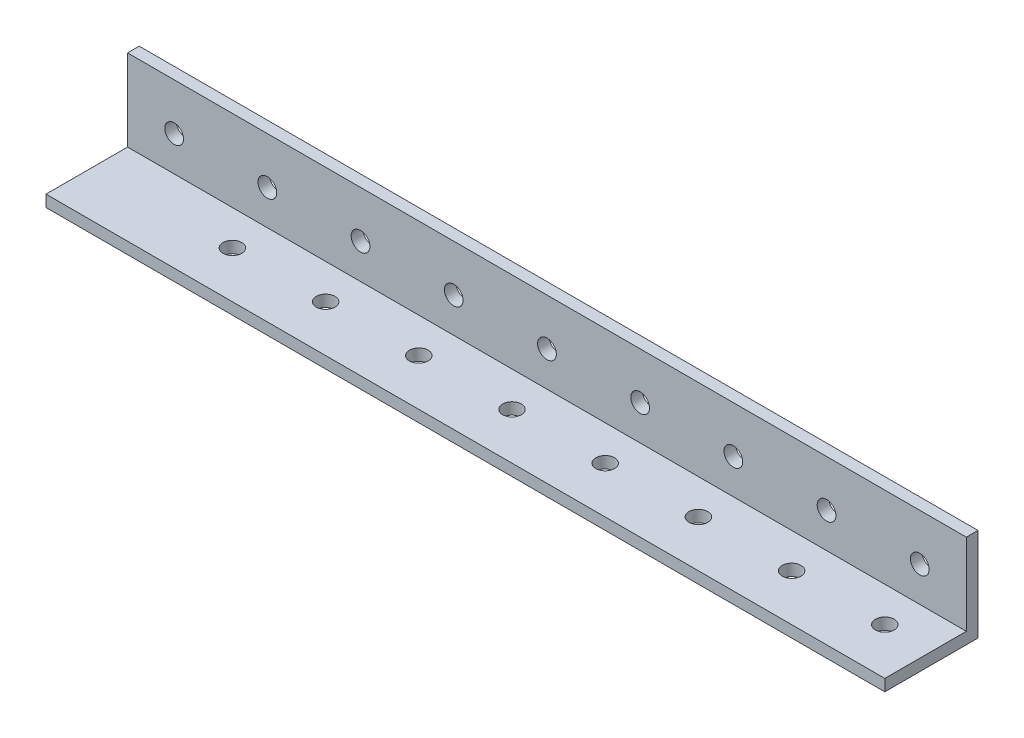
ISO-10303-21;
HEADER;
FILE_DESCRIPTION(('STEP AP214'),'2;1');
FILE_NAME('part.step','',(''),(''),'','','');
FILE_SCHEMA(('AUTOMOTIVE_DESIGN { 1 0 10303 214 1 1 1 1 }'));
ENDSEC;
DATA;
#1=APPLICATION_CONTEXT('core data for automotive mechanical design processes');
#2=APPLICATION_PROTOCOL_DEFINITION('international standard','automotive_design',2000,#1);
#3=PRODUCT_CONTEXT('',#1,'mechanical');
#4=PRODUCT('Part','Part','',(#3));
#5=PRODUCT_RELATED_PRODUCT_CATEGORY('part','',(#4));
#6=PRODUCT_DEFINITION_FORMATION('','',#4);
#7=PRODUCT_DEFINITION_CONTEXT('part definition',#1,'design');
#8=PRODUCT_DEFINITION('design','',#6,#7);
#9=PRODUCT_DEFINITION_SHAPE('','',#8);
#10=(LENGTH_UNIT() NAMED_UNIT(*) SI_UNIT(.MILLI.,.METRE.));
#11=(NAMED_UNIT(*) PLANE_ANGLE_UNIT() SI_UNIT($,.RADIAN.));
#12=(NAMED_UNIT(*) SI_UNIT($,.STERADIAN.) SOLID_ANGLE_UNIT());
#13=UNCERTAINTY_MEASURE_WITH_UNIT(LENGTH_MEASURE(1.E-05),#10,'distance_accuracy_value','');
#14=(GEOMETRIC_REPRESENTATION_CONTEXT(3) GLOBAL_UNCERTAINTY_ASSIGNED_CONTEXT((#13)) GLOBAL_UNIT_ASSIGNED_CONTEXT((#10,
#11,#12)) REPRESENTATION_CONTEXT('',''));
#15=CARTESIAN_POINT('',(0.,0.,0.));
#16=DIRECTION('',(0.,0.,1.));
#17=DIRECTION('',(1.,0.,0.));
#18=AXIS2_PLACEMENT_3D('',#15,#16,#17);
#19=CARTESIAN_POINT('',(228.6,76.2,0.));
#20=DIRECTION('',(0.,0.,-1.));
#21=DIRECTION('',(-1.,0.,0.));
#22=AXIS2_PLACEMENT_3D('',#19,#20,#21);
#23=PLANE('',#22);
#24=CARTESIAN_POINT('',(12.7,88.9,0.));
#25=DIRECTION('',(0.,0.,1.));
#26=DIRECTION('',(1.,0.,0.));
#27=AXIS2_PLACEMENT_3D('',#24,#25,#26);
#28=CIRCLE('',#27,2.55269999999999);
#29=CARTESIAN_POINT('',(15.2527,88.9,0.));
#30=VERTEX_POINT('',#29);
#31=EDGE_CURVE('E264',#30,#30,#28,.T.);
#32=ORIENTED_EDGE('',*,*,#31,.T.);
#33=EDGE_LOOP('',(#32));
#34=FACE_BOUND('',#33,.T.);
#35=CARTESIAN_POINT('',(38.1,88.9,0.));
#36=DIRECTION('',(0.,0.,1.));
#37=DIRECTION('',(1.,0.,0.));
#38=AXIS2_PLACEMENT_3D('',#35,#36,#37);
#39=CIRCLE('',#38,2.55269999999998);
#40=CARTESIAN_POINT('',(40.6527,88.9,0.));
#41=VERTEX_POINT('',#40);
#42=EDGE_CURVE('E268',#41,#41,#39,.T.);
#43=ORIENTED_EDGE('',*,*,#42,.T.);
#44=EDGE_LOOP('',(#43));
#45=FACE_BOUND('',#44,.T.);
#46=CARTESIAN_POINT('',(63.5,88.9,0.));
#47=DIRECTION('',(0.,0.,1.));
#48=DIRECTION('',(1.,0.,0.));
#49=AXIS2_PLACEMENT_3D('',#46,#47,#48);
#50=CIRCLE('',#49,2.55269999999999);
#51=CARTESIAN_POINT('',(66.0527,88.9,0.));
#52=VERTEX_POINT('',#51);
#53=EDGE_CURVE('E272',#52,#52,#50,.T.);
#54=ORIENTED_EDGE('',*,*,#53,.T.);
#55=EDGE_LOOP('',(#54));
#56=FACE_BOUND('',#55,.T.);
#57=CARTESIAN_POINT('',(88.9,88.9,0.));
#58=DIRECTION('',(0.,0.,1.));
#59=DIRECTION('',(1.,0.,0.));
#60=AXIS2_PLACEMENT_3D('',#57,#58,#59);
#61=CIRCLE('',#60,2.55269999999999);
#62=CARTESIAN_POINT('',(91.4527,88.9,0.));
#63=VERTEX_POINT('',#62);
#64=EDGE_CURVE('E276',#63,#63,#61,.T.);
#65=ORIENTED_EDGE('',*,*,#64,.T.);
#66=EDGE_LOOP('',(#65));
#67=FACE_BOUND('',#66,.T.);
#68=CARTESIAN_POINT('',(114.3,88.9,0.));
#69=DIRECTION('',(0.,0.,1.));
#70=DIRECTION('',(1.,0.,0.));
#71=AXIS2_PLACEMENT_3D('',#68,#69,#70);
#72=CIRCLE('',#71,2.55269999999999);
#73=CARTESIAN_POINT('',(116.8527,88.9,0.));
#74=VERTEX_POINT('',#73);
#75=EDGE_CURVE('E280',#74,#74,#72,.T.);
#76=ORIENTED_EDGE('',*,*,#75,.T.);
#77=EDGE_LOOP('',(#76));
#78=FACE_BOUND('',#77,.T.);
#79=CARTESIAN_POINT('',(139.7,88.9,0.));
#80=DIRECTION('',(0.,0.,1.));
#81=DIRECTION('',(1.,0.,0.));
#82=AXIS2_PLACEMENT_3D('',#79,#80,#81);
#83=CIRCLE('',#82,2.55269999999999);
#84=CARTESIAN_POINT('',(142.2527,88.9,0.));
#85=VERTEX_POINT('',#84);
#86=EDGE_CURVE('E284',#85,#85,#83,.T.);
#87=ORIENTED_EDGE('',*,*,#86,.T.);
#88=EDGE_LOOP('',(#87));
#89=FACE_BOUND('',#88,.T.);
#90=CARTESIAN_POINT('',(165.1,88.9,0.));
#91=DIRECTION('',(0.,0.,1.));
#92=DIRECTION('',(1.,0.,0.));
#93=AXIS2_PLACEMENT_3D('',#90,#91,#92);
#94=CIRCLE('',#93,2.55269999999999);
#95=CARTESIAN_POINT('',(167.6527,88.9,0.));
#96=VERTEX_POINT('',#95);
#97=EDGE_CURVE('E288',#96,#96,#94,.T.);
#98=ORIENTED_EDGE('',*,*,#97,.T.);
#99=EDGE_LOOP('',(#98));
#100=FACE_BOUND('',#99,.T.);
#101=CARTESIAN_POINT('',(190.5,88.9,0.));
#102=DIRECTION('',(0.,0.,1.));
#103=DIRECTION('',(1.,0.,0.));
#104=AXIS2_PLACEMENT_3D('',#101,#102,#103);
#105=CIRCLE('',#104,2.55269999999999);
#106=CARTESIAN_POINT('',(193.0527,88.9,0.));
#107=VERTEX_POINT('',#106);
#108=EDGE_CURVE('E292',#107,#107,#105,.T.);
#109=ORIENTED_EDGE('',*,*,#108,.T.);
#110=EDGE_LOOP('',(#109));
#111=FACE_BOUND('',#110,.T.);
#112=CARTESIAN_POINT('',(215.9,88.9,0.));
#113=DIRECTION('',(0.,0.,1.));
#114=DIRECTION('',(1.,0.,0.));
#115=AXIS2_PLACEMENT_3D('',#112,#113,#114);
#116=CIRCLE('',#115,2.55269999999999);
#117=CARTESIAN_POINT('',(218.4527,88.9,0.));
#118=VERTEX_POINT('',#117);
#119=EDGE_CURVE('E295',#118,#118,#116,.T.);
#120=ORIENTED_EDGE('',*,*,#119,.T.);
#121=EDGE_LOOP('',(#120));
#122=FACE_BOUND('',#121,.T.);
#123=DIRECTION('',(-1.,0.,0.));
#124=VECTOR('',#123,1.);
#125=CARTESIAN_POINT('',(228.6,101.6,0.));
#126=LINE('',#125,#124);
#127=CARTESIAN_POINT('',(228.6,101.6,0.));
#128=VERTEX_POINT('',#127);
#129=CARTESIAN_POINT('',(0.,101.6,0.));
#130=VERTEX_POINT('',#129);
#131=EDGE_CURVE('E213',#128,#130,#126,.T.);
#132=ORIENTED_EDGE('',*,*,#131,.F.);
#133=DIRECTION('',(0.,1.,0.));
#134=VECTOR('',#133,1.);
#135=CARTESIAN_POINT('',(228.6,76.2,0.));
#136=LINE('',#135,#134);
#137=CARTESIAN_POINT('',(228.6,76.2,0.));
#138=VERTEX_POINT('',#137);
#139=EDGE_CURVE('E11',#138,#128,#136,.T.);
#140=ORIENTED_EDGE('',*,*,#139,.F.);
#141=DIRECTION('',(-1.,0.,0.));
#142=VECTOR('',#141,1.);
#143=CARTESIAN_POINT('',(228.6,76.2,0.));
#144=LINE('',#143,#142);
#145=CARTESIAN_POINT('',(0.,76.2,0.));
#146=VERTEX_POINT('',#145);
#147=EDGE_CURVE('E216',#138,#146,#144,.T.);
#148=ORIENTED_EDGE('',*,*,#147,.T.);
#149=DIRECTION('',(0.,1.,0.));
#150=VECTOR('',#149,1.);
#151=CARTESIAN_POINT('',(0.,76.2,0.));
#152=LINE('',#151,#150);
#153=EDGE_CURVE('E91',#146,#130,#152,.T.);
#154=ORIENTED_EDGE('',*,*,#153,.T.);
#155=EDGE_LOOP('',(#132,#140,#148,#154));
#156=FACE_BOUND('',#155,.T.);
#157=ADVANCED_FACE('F45',(#34,#45,#56,#67,#78,#89,#100,#111,#122,#156),#23,.T.);
#158=CARTESIAN_POINT('',(228.6,76.2,25.4));
#159=DIRECTION('',(1.,0.,0.));
#160=DIRECTION('',(0.,0.,-1.));
#161=AXIS2_PLACEMENT_3D('',#158,#159,#160);
#162=PLANE('',#161);
#163=DIRECTION('',(0.,1.,0.));
#164=VECTOR('',#163,1.);
#165=CARTESIAN_POINT('',(228.6,79.375,3.175));
#166=LINE('',#165,#164);
#167=CARTESIAN_POINT('',(228.6,79.375,3.175));
#168=VERTEX_POINT('',#167);
#169=CARTESIAN_POINT('',(228.6,101.6,3.175));
#170=VERTEX_POINT('',#169);
#171=EDGE_CURVE('E62',#168,#170,#166,.T.);
#172=ORIENTED_EDGE('',*,*,#171,.F.);
#173=DIRECTION('',(0.,0.,-1.));
#174=VECTOR('',#173,1.);
#175=CARTESIAN_POINT('',(228.6,79.375,25.4));
#176=LINE('',#175,#174);
#177=CARTESIAN_POINT('',(228.6,79.375,25.4));
#178=VERTEX_POINT('',#177);
#179=EDGE_CURVE('E202',#178,#168,#176,.T.);
#180=ORIENTED_EDGE('',*,*,#179,.F.);
#181=DIRECTION('',(0.,1.,0.));
#182=VECTOR('',#181,1.);
#183=CARTESIAN_POINT('',(228.6,76.2,25.4));
#184=LINE('',#183,#182);
#185=CARTESIAN_POINT('',(228.6,76.2,25.4));
#186=VERTEX_POINT('',#185);
#187=EDGE_CURVE('E54',#186,#178,#184,.T.);
#188=ORIENTED_EDGE('',*,*,#187,.F.);
#189=DIRECTION('',(0.,0.,-1.));
#190=VECTOR('',#189,1.);
#191=CARTESIAN_POINT('',(228.6,76.2,25.4));
#192=LINE('',#191,#190);
#193=EDGE_CURVE('E136',#186,#138,#192,.T.);
#194=ORIENTED_EDGE('',*,*,#193,.T.);
#195=ORIENTED_EDGE('',*,*,#139,.T.);
#196=DIRECTION('',(0.,0.,-1.));
#197=VECTOR('',#196,1.);
#198=CARTESIAN_POINT('',(228.6,101.6,25.4));
#199=LINE('',#198,#197);
#200=EDGE_CURVE('E85',#170,#128,#199,.T.);
#201=ORIENTED_EDGE('',*,*,#200,.F.);
#202=EDGE_LOOP('',(#172,#180,#188,#194,#195,#201));
#203=FACE_BOUND('',#202,.T.);
#204=ADVANCED_FACE('F237',(#203),#162,.T.);
#205=CARTESIAN_POINT('',(0.,76.2,25.4));
#206=DIRECTION('',(0.,0.,1.));
#207=DIRECTION('',(1.,0.,0.));
#208=AXIS2_PLACEMENT_3D('',#205,#206,#207);
#209=PLANE('',#208);
#210=DIRECTION('',(1.,0.,0.));
#211=VECTOR('',#210,1.);
#212=CARTESIAN_POINT('',(0.,79.375,25.4));
#213=LINE('',#212,#211);
#214=CARTESIAN_POINT('',(0.,79.375,25.4));
#215=VERTEX_POINT('',#214);
#216=EDGE_CURVE('E112',#215,#178,#213,.T.);
#217=ORIENTED_EDGE('',*,*,#216,.F.);
#218=DIRECTION('',(0.,1.,0.));
#219=VECTOR('',#218,1.);
#220=CARTESIAN_POINT('',(0.,76.2,25.4));
#221=LINE('',#220,#219);
#222=CARTESIAN_POINT('',(0.,76.2,25.4));
#223=VERTEX_POINT('',#222);
#224=EDGE_CURVE('E125',#223,#215,#221,.T.);
#225=ORIENTED_EDGE('',*,*,#224,.F.);
#226=DIRECTION('',(1.,0.,0.));
#227=VECTOR('',#226,1.);
#228=CARTESIAN_POINT('',(0.,76.2,25.4));
#229=LINE('',#228,#227);
#230=EDGE_CURVE('E221',#223,#186,#229,.T.);
#231=ORIENTED_EDGE('',*,*,#230,.T.);
#232=ORIENTED_EDGE('',*,*,#187,.T.);
#233=EDGE_LOOP('',(#217,#225,#231,#232));
#234=FACE_BOUND('',#233,.T.);
#235=ADVANCED_FACE('F123',(#234),#209,.T.);
#236=CARTESIAN_POINT('',(0.,76.2,0.));
#237=DIRECTION('',(-1.,0.,0.));
#238=DIRECTION('',(0.,0.,1.));
#239=AXIS2_PLACEMENT_3D('',#236,#237,#238);
#240=PLANE('',#239);
#241=DIRECTION('',(0.,1.,0.));
#242=VECTOR('',#241,1.);
#243=CARTESIAN_POINT('',(0.,79.375,3.175));
#244=LINE('',#243,#242);
#245=CARTESIAN_POINT('',(0.,79.375,3.175));
#246=VERTEX_POINT('',#245);
#247=CARTESIAN_POINT('',(0.,101.6,3.175));
#248=VERTEX_POINT('',#247);
#249=EDGE_CURVE('E119',#246,#248,#244,.T.);
#250=ORIENTED_EDGE('',*,*,#249,.T.);
#251=DIRECTION('',(0.,0.,1.));
#252=VECTOR('',#251,1.);
#253=CARTESIAN_POINT('',(0.,101.6,0.));
#254=LINE('',#253,#252);
#255=EDGE_CURVE('E229',#130,#248,#254,.T.);
#256=ORIENTED_EDGE('',*,*,#255,.F.);
#257=ORIENTED_EDGE('',*,*,#153,.F.);
#258=DIRECTION('',(0.,0.,1.));
#259=VECTOR('',#258,1.);
#260=CARTESIAN_POINT('',(0.,76.2,0.));
#261=LINE('',#260,#259);
#262=EDGE_CURVE('E130',#146,#223,#261,.T.);
#263=ORIENTED_EDGE('',*,*,#262,.T.);
#264=ORIENTED_EDGE('',*,*,#224,.T.);
#265=DIRECTION('',(0.,0.,-1.));
#266=VECTOR('',#265,1.);
#267=CARTESIAN_POINT('',(0.,79.375,25.4));
#268=LINE('',#267,#266);
#269=EDGE_CURVE('E108',#215,#246,#268,.T.);
#270=ORIENTED_EDGE('',*,*,#269,.T.);
#271=EDGE_LOOP('',(#250,#256,#257,#263,#264,#270));
#272=FACE_BOUND('',#271,.T.);
#273=ADVANCED_FACE('F129',(#272),#240,.T.);
#274=CARTESIAN_POINT('',(0.,76.2,0.));
#275=DIRECTION('',(0.,1.,0.));
#276=DIRECTION('',(0.,0.,1.));
#277=AXIS2_PLACEMENT_3D('',#274,#275,#276);
#278=PLANE('',#277);
#279=CARTESIAN_POINT('',(38.1,76.2,12.7));
#280=DIRECTION('',(0.,-1.,0.));
#281=DIRECTION('',(0.,0.,-1.));
#282=AXIS2_PLACEMENT_3D('',#279,#280,#281);
#283=CIRCLE('',#282,2.55269999999998);
#284=CARTESIAN_POINT('',(38.1,76.2,10.1473));
#285=VERTEX_POINT('',#284);
#286=EDGE_CURVE('E176',#285,#285,#283,.T.);
#287=ORIENTED_EDGE('',*,*,#286,.F.);
#288=EDGE_LOOP('',(#287));
#289=FACE_BOUND('',#288,.T.);
#290=CARTESIAN_POINT('',(63.5,76.2,12.7));
#291=DIRECTION('',(0.,-1.,0.));
#292=DIRECTION('',(0.,0.,-1.));
#293=AXIS2_PLACEMENT_3D('',#290,#291,#292);
#294=CIRCLE('',#293,2.55269999999999);
#295=CARTESIAN_POINT('',(63.5,76.2,10.1473));
#296=VERTEX_POINT('',#295);
#297=EDGE_CURVE('E163',#296,#296,#294,.T.);
#298=ORIENTED_EDGE('',*,*,#297,.F.);
#299=EDGE_LOOP('',(#298));
#300=FACE_BOUND('',#299,.T.);
#301=CARTESIAN_POINT('',(88.9,76.2,12.7));
#302=DIRECTION('',(0.,-1.,0.));
#303=DIRECTION('',(0.,0.,-1.));
#304=AXIS2_PLACEMENT_3D('',#301,#302,#303);
#305=CIRCLE('',#304,2.55269999999999);
#306=CARTESIAN_POINT('',(88.9,76.2,10.1473));
#307=VERTEX_POINT('',#306);
#308=EDGE_CURVE('E159',#307,#307,#305,.T.);
#309=ORIENTED_EDGE('',*,*,#308,.F.);
#310=EDGE_LOOP('',(#309));
#311=FACE_BOUND('',#310,.T.);
#312=CARTESIAN_POINT('',(114.3,76.2,12.7));
#313=DIRECTION('',(0.,-1.,0.));
#314=DIRECTION('',(0.,0.,-1.));
#315=AXIS2_PLACEMENT_3D('',#312,#313,#314);
#316=CIRCLE('',#315,2.55269999999999);
#317=CARTESIAN_POINT('',(114.3,76.2,10.1473));
#318=VERTEX_POINT('',#317);
#319=EDGE_CURVE('E155',#318,#318,#316,.T.);
#320=ORIENTED_EDGE('',*,*,#319,.F.);
#321=EDGE_LOOP('',(#320));
#322=FACE_BOUND('',#321,.T.);
#323=CARTESIAN_POINT('',(139.7,76.2,12.7));
#324=DIRECTION('',(0.,-1.,0.));
#325=DIRECTION('',(0.,0.,-1.));
#326=AXIS2_PLACEMENT_3D('',#323,#324,#325);
#327=CIRCLE('',#326,2.55269999999999);
#328=CARTESIAN_POINT('',(139.7,76.2,10.1473));
#329=VERTEX_POINT('',#328);
#330=EDGE_CURVE('E150',#329,#329,#327,.T.);
#331=ORIENTED_EDGE('',*,*,#330,.F.);
#332=EDGE_LOOP('',(#331));
#333=FACE_BOUND('',#332,.T.);
#334=CARTESIAN_POINT('',(165.1,76.2,12.7));
#335=DIRECTION('',(0.,-1.,0.));
#336=DIRECTION('',(0.,0.,-1.));
#337=AXIS2_PLACEMENT_3D('',#334,#335,#336);
#338=CIRCLE('',#337,2.55269999999999);
#339=CARTESIAN_POINT('',(165.1,76.2,10.1473));
#340=VERTEX_POINT('',#339);
#341=EDGE_CURVE('E149',#340,#340,#338,.T.);
#342=ORIENTED_EDGE('',*,*,#341,.F.);
#343=EDGE_LOOP('',(#342));
#344=FACE_BOUND('',#343,.T.);
#345=CARTESIAN_POINT('',(190.5,76.2,12.7));
#346=DIRECTION('',(0.,-1.,0.));
#347=DIRECTION('',(0.,0.,-1.));
#348=AXIS2_PLACEMENT_3D('',#345,#346,#347);
#349=CIRCLE('',#348,2.55269999999999);
#350=CARTESIAN_POINT('',(190.5,76.2,10.1473));
#351=VERTEX_POINT('',#350);
#352=EDGE_CURVE('E144',#351,#351,#349,.T.);
#353=ORIENTED_EDGE('',*,*,#352,.F.);
#354=EDGE_LOOP('',(#353));
#355=FACE_BOUND('',#354,.T.);
#356=CARTESIAN_POINT('',(215.9,76.2,12.7));
#357=DIRECTION('',(0.,-1.,0.));
#358=DIRECTION('',(0.,0.,-1.));
#359=AXIS2_PLACEMENT_3D('',#356,#357,#358);
#360=CIRCLE('',#359,2.55269999999999);
#361=CARTESIAN_POINT('',(215.9,76.2,10.1473));
#362=VERTEX_POINT('',#361);
#363=EDGE_CURVE('E143',#362,#362,#360,.T.);
#364=ORIENTED_EDGE('',*,*,#363,.F.);
#365=EDGE_LOOP('',(#364));
#366=FACE_BOUND('',#365,.T.);
#367=ORIENTED_EDGE('',*,*,#147,.F.);
#368=ORIENTED_EDGE('',*,*,#193,.F.);
#369=ORIENTED_EDGE('',*,*,#230,.F.);
#370=ORIENTED_EDGE('',*,*,#262,.F.);
#371=EDGE_LOOP('',(#367,#368,#369,#370));
#372=FACE_BOUND('',#371,.T.);
#373=ADVANCED_FACE('F240',(#289,#300,#311,#322,#333,#344,#355,#366,#372),#278,.F.);
#374=CARTESIAN_POINT('',(0.,101.6,0.));
#375=DIRECTION('',(0.,1.,0.));
#376=DIRECTION('',(0.,0.,1.));
#377=AXIS2_PLACEMENT_3D('',#374,#375,#376);
#378=PLANE('',#377);
#379=DIRECTION('',(1.,0.,0.));
#380=VECTOR('',#379,1.);
#381=CARTESIAN_POINT('',(0.,101.6,3.175));
#382=LINE('',#381,#380);
#383=EDGE_CURVE('E210',#248,#170,#382,.T.);
#384=ORIENTED_EDGE('',*,*,#383,.T.);
#385=ORIENTED_EDGE('',*,*,#200,.T.);
#386=ORIENTED_EDGE('',*,*,#131,.T.);
#387=ORIENTED_EDGE('',*,*,#255,.T.);
#388=EDGE_LOOP('',(#384,#385,#386,#387));
#389=FACE_BOUND('',#388,.T.);
#390=ADVANCED_FACE('F234',(#389),#378,.T.);
#391=CARTESIAN_POINT('',(0.,79.375,3.175));
#392=DIRECTION('',(0.,0.,-1.));
#393=DIRECTION('',(-1.,0.,0.));
#394=AXIS2_PLACEMENT_3D('',#391,#392,#393);
#395=PLANE('',#394);
#396=CARTESIAN_POINT('',(12.7,88.9,3.175));
#397=DIRECTION('',(0.,0.,1.));
#398=DIRECTION('',(1.,0.,0.));
#399=AXIS2_PLACEMENT_3D('',#396,#397,#398);
#400=CIRCLE('',#399,2.55269999999999);
#401=CARTESIAN_POINT('',(15.2527,88.9,3.175));
#402=VERTEX_POINT('',#401);
#403=EDGE_CURVE('E349',#402,#402,#400,.T.);
#404=ORIENTED_EDGE('',*,*,#403,.F.);
#405=EDGE_LOOP('',(#404));
#406=FACE_BOUND('',#405,.T.);
#407=CARTESIAN_POINT('',(38.1,88.9,3.175));
#408=DIRECTION('',(0.,0.,1.));
#409=DIRECTION('',(1.,0.,0.));
#410=AXIS2_PLACEMENT_3D('',#407,#408,#409);
#411=CIRCLE('',#410,2.55269999999998);
#412=CARTESIAN_POINT('',(40.6527,88.9,3.175));
#413=VERTEX_POINT('',#412);
#414=EDGE_CURVE('E343',#413,#413,#411,.T.);
#415=ORIENTED_EDGE('',*,*,#414,.F.);
#416=EDGE_LOOP('',(#415));
#417=FACE_BOUND('',#416,.T.);
#418=CARTESIAN_POINT('',(63.5,88.9,3.175));
#419=DIRECTION('',(0.,0.,1.));
#420=DIRECTION('',(1.,0.,0.));
#421=AXIS2_PLACEMENT_3D('',#418,#419,#420);
#422=CIRCLE('',#421,2.55269999999999);
#423=CARTESIAN_POINT('',(66.0527,88.9,3.175));
#424=VERTEX_POINT('',#423);
#425=EDGE_CURVE('E337',#424,#424,#422,.T.);
#426=ORIENTED_EDGE('',*,*,#425,.F.);
#427=EDGE_LOOP('',(#426));
#428=FACE_BOUND('',#427,.T.);
#429=CARTESIAN_POINT('',(88.9,88.9,3.175));
#430=DIRECTION('',(0.,0.,1.));
#431=DIRECTION('',(1.,0.,0.));
#432=AXIS2_PLACEMENT_3D('',#429,#430,#431);
#433=CIRCLE('',#432,2.55269999999999);
#434=CARTESIAN_POINT('',(91.4527,88.9,3.175));
#435=VERTEX_POINT('',#434);
#436=EDGE_CURVE('E331',#435,#435,#433,.T.);
#437=ORIENTED_EDGE('',*,*,#436,.F.);
#438=EDGE_LOOP('',(#437));
#439=FACE_BOUND('',#438,.T.);
#440=CARTESIAN_POINT('',(114.3,88.9,3.175));
#441=DIRECTION('',(0.,0.,1.));
#442=DIRECTION('',(1.,0.,0.));
#443=AXIS2_PLACEMENT_3D('',#440,#441,#442);
#444=CIRCLE('',#443,2.55269999999999);
#445=CARTESIAN_POINT('',(116.8527,88.9,3.175));
#446=VERTEX_POINT('',#445);
#447=EDGE_CURVE('E325',#446,#446,#444,.T.);
#448=ORIENTED_EDGE('',*,*,#447,.F.);
#449=EDGE_LOOP('',(#448));
#450=FACE_BOUND('',#449,.T.);
#451=CARTESIAN_POINT('',(139.7,88.9,3.175));
#452=DIRECTION('',(0.,0.,1.));
#453=DIRECTION('',(1.,0.,0.));
#454=AXIS2_PLACEMENT_3D('',#451,#452,#453);
#455=CIRCLE('',#454,2.55269999999999);
#456=CARTESIAN_POINT('',(142.2527,88.9,3.175));
#457=VERTEX_POINT('',#456);
#458=EDGE_CURVE('E319',#457,#457,#455,.T.);
#459=ORIENTED_EDGE('',*,*,#458,.F.);
#460=EDGE_LOOP('',(#459));
#461=FACE_BOUND('',#460,.T.);
#462=CARTESIAN_POINT('',(165.1,88.9,3.175));
#463=DIRECTION('',(0.,0.,1.));
#464=DIRECTION('',(1.,0.,0.));
#465=AXIS2_PLACEMENT_3D('',#462,#463,#464);
#466=CIRCLE('',#465,2.55269999999999);
#467=CARTESIAN_POINT('',(167.6527,88.9,3.175));
#468=VERTEX_POINT('',#467);
#469=EDGE_CURVE('E313',#468,#468,#466,.T.);
#470=ORIENTED_EDGE('',*,*,#469,.F.);
#471=EDGE_LOOP('',(#470));
#472=FACE_BOUND('',#471,.T.);
#473=CARTESIAN_POINT('',(190.5,88.9,3.175));
#474=DIRECTION('',(0.,0.,1.));
#475=DIRECTION('',(1.,0.,0.));
#476=AXIS2_PLACEMENT_3D('',#473,#474,#475);
#477=CIRCLE('',#476,2.55269999999999);
#478=CARTESIAN_POINT('',(193.0527,88.9,3.175));
#479=VERTEX_POINT('',#478);
#480=EDGE_CURVE('E307',#479,#479,#477,.T.);
#481=ORIENTED_EDGE('',*,*,#480,.F.);
#482=EDGE_LOOP('',(#481));
#483=FACE_BOUND('',#482,.T.);
#484=CARTESIAN_POINT('',(215.9,88.9,3.175));
#485=DIRECTION('',(0.,0.,1.));
#486=DIRECTION('',(1.,0.,0.));
#487=AXIS2_PLACEMENT_3D('',#484,#485,#486);
#488=CIRCLE('',#487,2.55269999999999);
#489=CARTESIAN_POINT('',(218.4527,88.9,3.175));
#490=VERTEX_POINT('',#489);
#491=EDGE_CURVE('E298',#490,#490,#488,.T.);
#492=ORIENTED_EDGE('',*,*,#491,.F.);
#493=EDGE_LOOP('',(#492));
#494=FACE_BOUND('',#493,.T.);
#495=ORIENTED_EDGE('',*,*,#171,.T.);
#496=ORIENTED_EDGE('',*,*,#383,.F.);
#497=ORIENTED_EDGE('',*,*,#249,.F.);
#498=DIRECTION('',(1.,0.,0.));
#499=VECTOR('',#498,1.);
#500=CARTESIAN_POINT('',(0.,79.375,3.175));
#501=LINE('',#500,#499);
#502=EDGE_CURVE('E114',#246,#168,#501,.T.);
#503=ORIENTED_EDGE('',*,*,#502,.T.);
#504=EDGE_LOOP('',(#495,#496,#497,#503));
#505=FACE_BOUND('',#504,.T.);
#506=ADVANCED_FACE('F235',(#406,#417,#428,#439,#450,#461,#472,#483,#494,#505),#395,.F.);
#507=CARTESIAN_POINT('',(0.,79.375,25.4));
#508=DIRECTION('',(0.,-1.,0.));
#509=DIRECTION('',(0.,0.,-1.));
#510=AXIS2_PLACEMENT_3D('',#507,#508,#509);
#511=PLANE('',#510);
#512=CARTESIAN_POINT('',(38.1,79.375,12.7));
#513=DIRECTION('',(0.,-1.,0.));
#514=DIRECTION('',(0.,0.,-1.));
#515=AXIS2_PLACEMENT_3D('',#512,#513,#514);
#516=CIRCLE('',#515,2.55269999999998);
#517=CARTESIAN_POINT('',(38.1,79.375,10.1473));
#518=VERTEX_POINT('',#517);
#519=EDGE_CURVE('E48',#518,#518,#516,.T.);
#520=ORIENTED_EDGE('',*,*,#519,.T.);
#521=EDGE_LOOP('',(#520));
#522=FACE_BOUND('',#521,.T.);
#523=CARTESIAN_POINT('',(63.5,79.375,12.7));
#524=DIRECTION('',(0.,-1.,0.));
#525=DIRECTION('',(0.,0.,-1.));
#526=AXIS2_PLACEMENT_3D('',#523,#524,#525);
#527=CIRCLE('',#526,2.55269999999999);
#528=CARTESIAN_POINT('',(63.5,79.375,10.1473));
#529=VERTEX_POINT('',#528);
#530=EDGE_CURVE('E160',#529,#529,#527,.T.);
#531=ORIENTED_EDGE('',*,*,#530,.T.);
#532=EDGE_LOOP('',(#531));
#533=FACE_BOUND('',#532,.T.);
#534=CARTESIAN_POINT('',(88.9,79.375,12.7));
#535=DIRECTION('',(0.,-1.,0.));
#536=DIRECTION('',(0.,0.,-1.));
#537=AXIS2_PLACEMENT_3D('',#534,#535,#536);
#538=CIRCLE('',#537,2.55269999999999);
#539=CARTESIAN_POINT('',(88.9,79.375,10.1473));
#540=VERTEX_POINT('',#539);
#541=EDGE_CURVE('E156',#540,#540,#538,.T.);
#542=ORIENTED_EDGE('',*,*,#541,.T.);
#543=EDGE_LOOP('',(#542));
#544=FACE_BOUND('',#543,.T.);
#545=CARTESIAN_POINT('',(114.3,79.375,12.7));
#546=DIRECTION('',(0.,-1.,0.));
#547=DIRECTION('',(0.,0.,-1.));
#548=AXIS2_PLACEMENT_3D('',#545,#546,#547);
#549=CIRCLE('',#548,2.55269999999999);
#550=CARTESIAN_POINT('',(114.3,79.375,10.1473));
#551=VERTEX_POINT('',#550);
#552=EDGE_CURVE('E151',#551,#551,#549,.T.);
#553=ORIENTED_EDGE('',*,*,#552,.T.);
#554=EDGE_LOOP('',(#553));
#555=FACE_BOUND('',#554,.T.);
#556=CARTESIAN_POINT('',(139.7,79.375,12.7));
#557=DIRECTION('',(0.,-1.,0.));
#558=DIRECTION('',(0.,0.,-1.));
#559=AXIS2_PLACEMENT_3D('',#556,#557,#558);
#560=CIRCLE('',#559,2.55269999999999);
#561=CARTESIAN_POINT('',(139.7,79.375,10.1473));
#562=VERTEX_POINT('',#561);
#563=EDGE_CURVE('E145',#562,#562,#560,.T.);
#564=ORIENTED_EDGE('',*,*,#563,.T.);
#565=EDGE_LOOP('',(#564));
#566=FACE_BOUND('',#565,.T.);
#567=CARTESIAN_POINT('',(165.1,79.375,12.7));
#568=DIRECTION('',(0.,-1.,0.));
#569=DIRECTION('',(0.,0.,-1.));
#570=AXIS2_PLACEMENT_3D('',#567,#568,#569);
#571=CIRCLE('',#570,2.55269999999999);
#572=CARTESIAN_POINT('',(165.1,79.375,10.1473));
#573=VERTEX_POINT('',#572);
#574=EDGE_CURVE('E189',#573,#573,#571,.T.);
#575=ORIENTED_EDGE('',*,*,#574,.T.);
#576=EDGE_LOOP('',(#575));
#577=FACE_BOUND('',#576,.T.);
#578=CARTESIAN_POINT('',(190.5,79.375,12.7));
#579=DIRECTION('',(0.,-1.,0.));
#580=DIRECTION('',(0.,0.,-1.));
#581=AXIS2_PLACEMENT_3D('',#578,#579,#580);
#582=CIRCLE('',#581,2.55269999999999);
#583=CARTESIAN_POINT('',(190.5,79.375,10.1473));
#584=VERTEX_POINT('',#583);
#585=EDGE_CURVE('E139',#584,#584,#582,.T.);
#586=ORIENTED_EDGE('',*,*,#585,.T.);
#587=EDGE_LOOP('',(#586));
#588=FACE_BOUND('',#587,.T.);
#589=CARTESIAN_POINT('',(215.9,79.375,12.7));
#590=DIRECTION('',(0.,-1.,0.));
#591=DIRECTION('',(0.,0.,-1.));
#592=AXIS2_PLACEMENT_3D('',#589,#590,#591);
#593=CIRCLE('',#592,2.55269999999999);
#594=CARTESIAN_POINT('',(215.9,79.375,10.1473));
#595=VERTEX_POINT('',#594);
#596=EDGE_CURVE('E199',#595,#595,#593,.T.);
#597=ORIENTED_EDGE('',*,*,#596,.T.);
#598=EDGE_LOOP('',(#597));
#599=FACE_BOUND('',#598,.T.);
#600=ORIENTED_EDGE('',*,*,#179,.T.);
#601=ORIENTED_EDGE('',*,*,#502,.F.);
#602=ORIENTED_EDGE('',*,*,#269,.F.);
#603=ORIENTED_EDGE('',*,*,#216,.T.);
#604=EDGE_LOOP('',(#600,#601,#602,#603));
#605=FACE_BOUND('',#604,.T.);
#606=ADVANCED_FACE('F111',(#522,#533,#544,#555,#566,#577,#588,#599,#605),#511,.F.);
#607=CARTESIAN_POINT('',(215.9,76.2,12.7));
#608=DIRECTION('',(0.,-1.,0.));
#609=DIRECTION('',(0.,0.,-1.));
#610=AXIS2_PLACEMENT_3D('',#607,#608,#609);
#611=CYLINDRICAL_SURFACE('',#610,2.55269999999999);
#612=ORIENTED_EDGE('',*,*,#363,.T.);
#613=EDGE_LOOP('',(#612));
#614=FACE_BOUND('',#613,.T.);
#615=ORIENTED_EDGE('',*,*,#596,.F.);
#616=EDGE_LOOP('',(#615));
#617=FACE_BOUND('',#616,.T.);
#618=ADVANCED_FACE('F411',(#614,#617),#611,.F.);
#619=CARTESIAN_POINT('',(190.5,76.2,12.7));
#620=DIRECTION('',(0.,-1.,0.));
#621=DIRECTION('',(0.,0.,-1.));
#622=AXIS2_PLACEMENT_3D('',#619,#620,#621);
#623=CYLINDRICAL_SURFACE('',#622,2.55269999999999);
#624=ORIENTED_EDGE('',*,*,#352,.T.);
#625=EDGE_LOOP('',(#624));
#626=FACE_BOUND('',#625,.T.);
#627=ORIENTED_EDGE('',*,*,#585,.F.);
#628=EDGE_LOOP('',(#627));
#629=FACE_BOUND('',#628,.T.);
#630=ADVANCED_FACE('F407',(#626,#629),#623,.F.);
#631=CARTESIAN_POINT('',(165.1,76.2,12.7));
#632=DIRECTION('',(0.,-1.,0.));
#633=DIRECTION('',(0.,0.,-1.));
#634=AXIS2_PLACEMENT_3D('',#631,#632,#633);
#635=CYLINDRICAL_SURFACE('',#634,2.55269999999999);
#636=ORIENTED_EDGE('',*,*,#341,.T.);
#637=EDGE_LOOP('',(#636));
#638=FACE_BOUND('',#637,.T.);
#639=ORIENTED_EDGE('',*,*,#574,.F.);
#640=EDGE_LOOP('',(#639));
#641=FACE_BOUND('',#640,.T.);
#642=ADVANCED_FACE('F403',(#638,#641),#635,.F.);
#643=CARTESIAN_POINT('',(139.7,76.2,12.7));
#644=DIRECTION('',(0.,-1.,0.));
#645=DIRECTION('',(0.,0.,-1.));
#646=AXIS2_PLACEMENT_3D('',#643,#644,#645);
#647=CYLINDRICAL_SURFACE('',#646,2.55269999999999);
#648=ORIENTED_EDGE('',*,*,#330,.T.);
#649=EDGE_LOOP('',(#648));
#650=FACE_BOUND('',#649,.T.);
#651=ORIENTED_EDGE('',*,*,#563,.F.);
#652=EDGE_LOOP('',(#651));
#653=FACE_BOUND('',#652,.T.);
#654=ADVANCED_FACE('F399',(#650,#653),#647,.F.);
#655=CARTESIAN_POINT('',(114.3,76.2,12.7));
#656=DIRECTION('',(0.,-1.,0.));
#657=DIRECTION('',(0.,0.,-1.));
#658=AXIS2_PLACEMENT_3D('',#655,#656,#657);
#659=CYLINDRICAL_SURFACE('',#658,2.55269999999999);
#660=ORIENTED_EDGE('',*,*,#319,.T.);
#661=EDGE_LOOP('',(#660));
#662=FACE_BOUND('',#661,.T.);
#663=ORIENTED_EDGE('',*,*,#552,.F.);
#664=EDGE_LOOP('',(#663));
#665=FACE_BOUND('',#664,.T.);
#666=ADVANCED_FACE('F395',(#662,#665),#659,.F.);
#667=CARTESIAN_POINT('',(88.9,76.2,12.7));
#668=DIRECTION('',(0.,-1.,0.));
#669=DIRECTION('',(0.,0.,-1.));
#670=AXIS2_PLACEMENT_3D('',#667,#668,#669);
#671=CYLINDRICAL_SURFACE('',#670,2.55269999999999);
#672=ORIENTED_EDGE('',*,*,#308,.T.);
#673=EDGE_LOOP('',(#672));
#674=FACE_BOUND('',#673,.T.);
#675=ORIENTED_EDGE('',*,*,#541,.F.);
#676=EDGE_LOOP('',(#675));
#677=FACE_BOUND('',#676,.T.);
#678=ADVANCED_FACE('F392',(#674,#677),#671,.F.);
#679=CARTESIAN_POINT('',(63.5,76.2,12.7));
#680=DIRECTION('',(0.,-1.,0.));
#681=DIRECTION('',(0.,0.,-1.));
#682=AXIS2_PLACEMENT_3D('',#679,#680,#681);
#683=CYLINDRICAL_SURFACE('',#682,2.55269999999999);
#684=ORIENTED_EDGE('',*,*,#297,.T.);
#685=EDGE_LOOP('',(#684));
#686=FACE_BOUND('',#685,.T.);
#687=ORIENTED_EDGE('',*,*,#530,.F.);
#688=EDGE_LOOP('',(#687));
#689=FACE_BOUND('',#688,.T.);
#690=ADVANCED_FACE('F385',(#686,#689),#683,.F.);
#691=CARTESIAN_POINT('',(38.1,76.2,12.7));
#692=DIRECTION('',(0.,-1.,0.));
#693=DIRECTION('',(0.,0.,-1.));
#694=AXIS2_PLACEMENT_3D('',#691,#692,#693);
#695=CYLINDRICAL_SURFACE('',#694,2.55269999999998);
#696=ORIENTED_EDGE('',*,*,#286,.T.);
#697=EDGE_LOOP('',(#696));
#698=FACE_BOUND('',#697,.T.);
#699=ORIENTED_EDGE('',*,*,#519,.F.);
#700=EDGE_LOOP('',(#699));
#701=FACE_BOUND('',#700,.T.);
#702=ADVANCED_FACE('F377',(#698,#701),#695,.F.);
#703=CARTESIAN_POINT('',(215.9,88.9,3.175));
#704=DIRECTION('',(0.,0.,1.));
#705=DIRECTION('',(1.,0.,0.));
#706=AXIS2_PLACEMENT_3D('',#703,#704,#705);
#707=CYLINDRICAL_SURFACE('',#706,2.55269999999999);
#708=ORIENTED_EDGE('',*,*,#119,.F.);
#709=EDGE_LOOP('',(#708));
#710=FACE_BOUND('',#709,.T.);
#711=ORIENTED_EDGE('',*,*,#491,.T.);
#712=EDGE_LOOP('',(#711));
#713=FACE_BOUND('',#712,.T.);
#714=ADVANCED_FACE('F374',(#710,#713),#707,.F.);
#715=CARTESIAN_POINT('',(190.5,88.9,3.175));
#716=DIRECTION('',(0.,0.,1.));
#717=DIRECTION('',(1.,0.,0.));
#718=AXIS2_PLACEMENT_3D('',#715,#716,#717);
#719=CYLINDRICAL_SURFACE('',#718,2.55269999999999);
#720=ORIENTED_EDGE('',*,*,#108,.F.);
#721=EDGE_LOOP('',(#720));
#722=FACE_BOUND('',#721,.T.);
#723=ORIENTED_EDGE('',*,*,#480,.T.);
#724=EDGE_LOOP('',(#723));
#725=FACE_BOUND('',#724,.T.);
#726=ADVANCED_FACE('F376',(#722,#725),#719,.F.);
#727=CARTESIAN_POINT('',(165.1,88.9,3.175));
#728=DIRECTION('',(0.,0.,1.));
#729=DIRECTION('',(1.,0.,0.));
#730=AXIS2_PLACEMENT_3D('',#727,#728,#729);
#731=CYLINDRICAL_SURFACE('',#730,2.55269999999999);
#732=ORIENTED_EDGE('',*,*,#97,.F.);
#733=EDGE_LOOP('',(#732));
#734=FACE_BOUND('',#733,.T.);
#735=ORIENTED_EDGE('',*,*,#469,.T.);
#736=EDGE_LOOP('',(#735));
#737=FACE_BOUND('',#736,.T.);
#738=ADVANCED_FACE('F382',(#734,#737),#731,.F.);
#739=CARTESIAN_POINT('',(139.7,88.9,3.175));
#740=DIRECTION('',(0.,0.,1.));
#741=DIRECTION('',(1.,0.,0.));
#742=AXIS2_PLACEMENT_3D('',#739,#740,#741);
#743=CYLINDRICAL_SURFACE('',#742,2.55269999999999);
#744=ORIENTED_EDGE('',*,*,#86,.F.);
#745=EDGE_LOOP('',(#744));
#746=FACE_BOUND('',#745,.T.);
#747=ORIENTED_EDGE('',*,*,#458,.T.);
#748=EDGE_LOOP('',(#747));
#749=FACE_BOUND('',#748,.T.);
#750=ADVANCED_FACE('F499',(#746,#749),#743,.F.);
#751=CARTESIAN_POINT('',(114.3,88.9,3.175));
#752=DIRECTION('',(0.,0.,1.));
#753=DIRECTION('',(1.,0.,0.));
#754=AXIS2_PLACEMENT_3D('',#751,#752,#753);
#755=CYLINDRICAL_SURFACE('',#754,2.55269999999999);
#756=ORIENTED_EDGE('',*,*,#75,.F.);
#757=EDGE_LOOP('',(#756));
#758=FACE_BOUND('',#757,.T.);
#759=ORIENTED_EDGE('',*,*,#447,.T.);
#760=EDGE_LOOP('',(#759));
#761=FACE_BOUND('',#760,.T.);
#762=ADVANCED_FACE('F508',(#758,#761),#755,.F.);
#763=CARTESIAN_POINT('',(88.9,88.9,3.175));
#764=DIRECTION('',(0.,0.,1.));
#765=DIRECTION('',(1.,0.,0.));
#766=AXIS2_PLACEMENT_3D('',#763,#764,#765);
#767=CYLINDRICAL_SURFACE('',#766,2.55269999999999);
#768=ORIENTED_EDGE('',*,*,#64,.F.);
#769=EDGE_LOOP('',(#768));
#770=FACE_BOUND('',#769,.T.);
#771=ORIENTED_EDGE('',*,*,#436,.T.);
#772=EDGE_LOOP('',(#771));
#773=FACE_BOUND('',#772,.T.);
#774=ADVANCED_FACE('F518',(#770,#773),#767,.F.);
#775=CARTESIAN_POINT('',(63.5,88.9,3.175));
#776=DIRECTION('',(0.,0.,1.));
#777=DIRECTION('',(1.,0.,0.));
#778=AXIS2_PLACEMENT_3D('',#775,#776,#777);
#779=CYLINDRICAL_SURFACE('',#778,2.55269999999999);
#780=ORIENTED_EDGE('',*,*,#53,.F.);
#781=EDGE_LOOP('',(#780));
#782=FACE_BOUND('',#781,.T.);
#783=ORIENTED_EDGE('',*,*,#425,.T.);
#784=EDGE_LOOP('',(#783));
#785=FACE_BOUND('',#784,.T.);
#786=ADVANCED_FACE('F528',(#782,#785),#779,.F.);
#787=CARTESIAN_POINT('',(38.1,88.9,3.175));
#788=DIRECTION('',(0.,0.,1.));
#789=DIRECTION('',(1.,0.,0.));
#790=AXIS2_PLACEMENT_3D('',#787,#788,#789);
#791=CYLINDRICAL_SURFACE('',#790,2.55269999999998);
#792=ORIENTED_EDGE('',*,*,#42,.F.);
#793=EDGE_LOOP('',(#792));
#794=FACE_BOUND('',#793,.T.);
#795=ORIENTED_EDGE('',*,*,#414,.T.);
#796=EDGE_LOOP('',(#795));
#797=FACE_BOUND('',#796,.T.);
#798=ADVANCED_FACE('F538',(#794,#797),#791,.F.);
#799=CARTESIAN_POINT('',(12.7,88.9,3.175));
#800=DIRECTION('',(0.,0.,1.));
#801=DIRECTION('',(1.,0.,0.));
#802=AXIS2_PLACEMENT_3D('',#799,#800,#801);
#803=CYLINDRICAL_SURFACE('',#802,2.55269999999999);
#804=ORIENTED_EDGE('',*,*,#31,.F.);
#805=EDGE_LOOP('',(#804));
#806=FACE_BOUND('',#805,.T.);
#807=ORIENTED_EDGE('',*,*,#403,.T.);
#808=EDGE_LOOP('',(#807));
#809=FACE_BOUND('',#808,.T.);
#810=ADVANCED_FACE('F354',(#806,#809),#803,.F.);
#811=CLOSED_SHELL('',(#157,#204,#235,#273,#373,#390,#506,#606,#618,#630,#642,#654,#666,#678,
#690,#702,#714,#726,#738,#750,#762,#774,#786,#798,#810));
#812=MANIFOLD_SOLID_BREP('B2',#811);
#813=ADVANCED_BREP_SHAPE_REPRESENTATION('',(#18,#812),#14);
#814=SHAPE_DEFINITION_REPRESENTATION(#9,#813);
ENDSEC;
END-ISO-10303-21;
